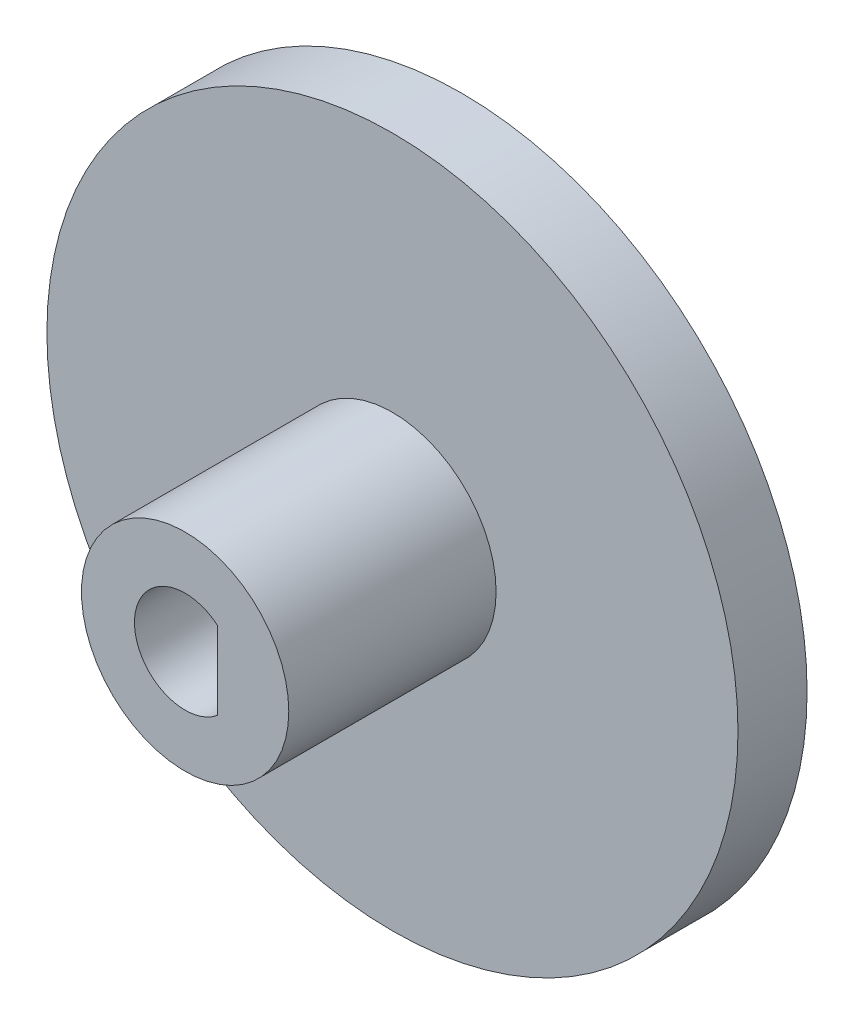
ISO-10303-21;
HEADER;
FILE_DESCRIPTION(('STEP AP214'),'2;1');
FILE_NAME('part.step','',(''),(''),'','','');
FILE_SCHEMA(('AUTOMOTIVE_DESIGN { 1 0 10303 214 1 1 1 1 }'));
ENDSEC;
DATA;
#1=APPLICATION_CONTEXT('core data for automotive mechanical design processes');
#2=APPLICATION_PROTOCOL_DEFINITION('international standard','automotive_design',2000,#1);
#3=PRODUCT_CONTEXT('',#1,'mechanical');
#4=PRODUCT('Part','Part','',(#3));
#5=PRODUCT_RELATED_PRODUCT_CATEGORY('part','',(#4));
#6=PRODUCT_DEFINITION_FORMATION('','',#4);
#7=PRODUCT_DEFINITION_CONTEXT('part definition',#1,'design');
#8=PRODUCT_DEFINITION('design','',#6,#7);
#9=PRODUCT_DEFINITION_SHAPE('','',#8);
#10=(LENGTH_UNIT() NAMED_UNIT(*) SI_UNIT(.MILLI.,.METRE.));
#11=(NAMED_UNIT(*) PLANE_ANGLE_UNIT() SI_UNIT($,.RADIAN.));
#12=(NAMED_UNIT(*) SI_UNIT($,.STERADIAN.) SOLID_ANGLE_UNIT());
#13=UNCERTAINTY_MEASURE_WITH_UNIT(LENGTH_MEASURE(1.E-05),#10,'distance_accuracy_value','');
#14=(GEOMETRIC_REPRESENTATION_CONTEXT(3) GLOBAL_UNCERTAINTY_ASSIGNED_CONTEXT((#13)) GLOBAL_UNIT_ASSIGNED_CONTEXT((#10,
#11,#12)) REPRESENTATION_CONTEXT('',''));
#15=CARTESIAN_POINT('',(0.,0.,0.));
#16=DIRECTION('',(0.,0.,1.));
#17=DIRECTION('',(1.,0.,0.));
#18=AXIS2_PLACEMENT_3D('',#15,#16,#17);
#19=CARTESIAN_POINT('',(0.,0.,9.));
#20=DIRECTION('',(0.,0.,1.));
#21=DIRECTION('',(1.,0.,0.));
#22=AXIS2_PLACEMENT_3D('',#19,#20,#21);
#23=PLANE('',#22);
#24=CARTESIAN_POINT('',(0.,0.,9.));
#25=DIRECTION('',(0.,0.,1.));
#26=DIRECTION('',(1.,0.,0.));
#27=AXIS2_PLACEMENT_3D('',#24,#25,#26);
#28=CIRCLE('',#27,4.5);
#29=CARTESIAN_POINT('',(4.5,0.,9.));
#30=VERTEX_POINT('',#29);
#31=EDGE_CURVE('E84',#30,#30,#28,.T.);
#32=ORIENTED_EDGE('',*,*,#31,.T.);
#33=EDGE_LOOP('',(#32));
#34=FACE_BOUND('',#33,.T.);
#35=DIRECTION('',(0.,-1.,0.));
#36=VECTOR('',#35,1.);
#37=CARTESIAN_POINT('',(1.4,0.,9.));
#38=LINE('',#37,#36);
#39=CARTESIAN_POINT('',(1.4,1.69705627484771,9.));
#40=VERTEX_POINT('',#39);
#41=CARTESIAN_POINT('',(1.4,-1.69705627484771,9.));
#42=VERTEX_POINT('',#41);
#43=EDGE_CURVE('E45',#40,#42,#38,.T.);
#44=ORIENTED_EDGE('',*,*,#43,.T.);
#45=CARTESIAN_POINT('',(0.,0.,9.));
#46=DIRECTION('',(0.,0.,1.));
#47=DIRECTION('',(1.,0.,0.));
#48=AXIS2_PLACEMENT_3D('',#45,#46,#47);
#49=CIRCLE('',#48,2.2);
#50=EDGE_CURVE('E11',#42,#40,#49,.F.);
#51=ORIENTED_EDGE('',*,*,#50,.T.);
#52=EDGE_LOOP('',(#44,#51));
#53=FACE_BOUND('',#52,.T.);
#54=ADVANCED_FACE('F37',(#34,#53),#23,.T.);
#55=CARTESIAN_POINT('',(0.,0.,9.));
#56=DIRECTION('',(0.,0.,-1.));
#57=DIRECTION('',(-1.,0.,0.));
#58=AXIS2_PLACEMENT_3D('',#55,#56,#57);
#59=CYLINDRICAL_SURFACE('',#58,4.5);
#60=ORIENTED_EDGE('',*,*,#31,.F.);
#61=EDGE_LOOP('',(#60));
#62=FACE_BOUND('',#61,.T.);
#63=CARTESIAN_POINT('',(0.,0.,0.));
#64=DIRECTION('',(0.,0.,1.));
#65=DIRECTION('',(1.,0.,0.));
#66=AXIS2_PLACEMENT_3D('',#63,#64,#65);
#67=CIRCLE('',#66,4.5);
#68=CARTESIAN_POINT('',(4.5,0.,0.));
#69=VERTEX_POINT('',#68);
#70=EDGE_CURVE('E81',#69,#69,#67,.T.);
#71=ORIENTED_EDGE('',*,*,#70,.T.);
#72=EDGE_LOOP('',(#71));
#73=FACE_BOUND('',#72,.T.);
#74=ADVANCED_FACE('F39',(#62,#73),#59,.T.);
#75=CARTESIAN_POINT('',(0.,0.,-3.));
#76=DIRECTION('',(0.,0.,1.));
#77=DIRECTION('',(1.,0.,0.));
#78=AXIS2_PLACEMENT_3D('',#75,#76,#77);
#79=CYLINDRICAL_SURFACE('',#78,15.);
#80=CARTESIAN_POINT('',(0.,0.,-3.));
#81=DIRECTION('',(0.,0.,1.));
#82=DIRECTION('',(1.,0.,0.));
#83=AXIS2_PLACEMENT_3D('',#80,#81,#82);
#84=CIRCLE('',#83,15.);
#85=CARTESIAN_POINT('',(15.,0.,-3.));
#86=VERTEX_POINT('',#85);
#87=EDGE_CURVE('E78',#86,#86,#84,.T.);
#88=ORIENTED_EDGE('',*,*,#87,.T.);
#89=EDGE_LOOP('',(#88));
#90=FACE_BOUND('',#89,.T.);
#91=CARTESIAN_POINT('',(0.,0.,0.));
#92=DIRECTION('',(0.,0.,1.));
#93=DIRECTION('',(1.,0.,0.));
#94=AXIS2_PLACEMENT_3D('',#91,#92,#93);
#95=CIRCLE('',#94,15.);
#96=CARTESIAN_POINT('',(15.,0.,0.));
#97=VERTEX_POINT('',#96);
#98=EDGE_CURVE('E66',#97,#97,#95,.T.);
#99=ORIENTED_EDGE('',*,*,#98,.F.);
#100=EDGE_LOOP('',(#99));
#101=FACE_BOUND('',#100,.T.);
#102=ADVANCED_FACE('F94',(#90,#101),#79,.T.);
#103=CARTESIAN_POINT('',(0.,0.,-3.));
#104=DIRECTION('',(0.,0.,1.));
#105=DIRECTION('',(1.,0.,0.));
#106=AXIS2_PLACEMENT_3D('',#103,#104,#105);
#107=PLANE('',#106);
#108=ORIENTED_EDGE('',*,*,#87,.F.);
#109=EDGE_LOOP('',(#108));
#110=FACE_BOUND('',#109,.T.);
#111=ADVANCED_FACE('F99',(#110),#107,.F.);
#112=CARTESIAN_POINT('',(0.,0.,0.));
#113=DIRECTION('',(0.,0.,1.));
#114=DIRECTION('',(1.,0.,0.));
#115=AXIS2_PLACEMENT_3D('',#112,#113,#114);
#116=PLANE('',#115);
#117=ORIENTED_EDGE('',*,*,#70,.F.);
#118=EDGE_LOOP('',(#117));
#119=FACE_BOUND('',#118,.T.);
#120=ORIENTED_EDGE('',*,*,#98,.T.);
#121=EDGE_LOOP('',(#120));
#122=FACE_BOUND('',#121,.T.);
#123=ADVANCED_FACE('F101',(#119,#122),#116,.T.);
#124=CARTESIAN_POINT('',(0.,0.,10.));
#125=DIRECTION('',(0.,0.,-1.));
#126=DIRECTION('',(-1.,0.,0.));
#127=AXIS2_PLACEMENT_3D('',#124,#125,#126);
#128=CYLINDRICAL_SURFACE('',#127,2.2);
#129=DIRECTION('',(0.,0.,-1.));
#130=VECTOR('',#129,1.);
#131=CARTESIAN_POINT('',(1.4,-1.69705627484771,10.));
#132=LINE('',#131,#130);
#133=CARTESIAN_POINT('',(1.4,-1.69705627484771,0.));
#134=VERTEX_POINT('',#133);
#135=EDGE_CURVE('E52',#42,#134,#132,.T.);
#136=ORIENTED_EDGE('',*,*,#135,.T.);
#137=CARTESIAN_POINT('',(0.,0.,0.));
#138=DIRECTION('',(0.,0.,1.));
#139=DIRECTION('',(1.,0.,0.));
#140=AXIS2_PLACEMENT_3D('',#137,#138,#139);
#141=CIRCLE('',#140,2.2);
#142=CARTESIAN_POINT('',(1.4,1.69705627484771,0.));
#143=VERTEX_POINT('',#142);
#144=EDGE_CURVE('E65',#143,#134,#141,.T.);
#145=ORIENTED_EDGE('',*,*,#144,.F.);
#146=DIRECTION('',(0.,0.,-1.));
#147=VECTOR('',#146,1.);
#148=CARTESIAN_POINT('',(1.4,1.69705627484771,10.));
#149=LINE('',#148,#147);
#150=EDGE_CURVE('E67',#40,#143,#149,.T.);
#151=ORIENTED_EDGE('',*,*,#150,.F.);
#152=ORIENTED_EDGE('',*,*,#50,.F.);
#153=EDGE_LOOP('',(#136,#145,#151,#152));
#154=FACE_BOUND('',#153,.T.);
#155=ADVANCED_FACE('F63',(#154),#128,.F.);
#156=CARTESIAN_POINT('',(1.4,1.69705627484771,10.));
#157=DIRECTION('',(-1.,0.,0.));
#158=DIRECTION('',(0.,0.,1.));
#159=AXIS2_PLACEMENT_3D('',#156,#157,#158);
#160=PLANE('',#159);
#161=ORIENTED_EDGE('',*,*,#150,.T.);
#162=DIRECTION('',(0.,1.,0.));
#163=VECTOR('',#162,1.);
#164=CARTESIAN_POINT('',(1.4,1.69705627484771,0.));
#165=LINE('',#164,#163);
#166=EDGE_CURVE('E70',#134,#143,#165,.T.);
#167=ORIENTED_EDGE('',*,*,#166,.F.);
#168=ORIENTED_EDGE('',*,*,#135,.F.);
#169=ORIENTED_EDGE('',*,*,#43,.F.);
#170=EDGE_LOOP('',(#161,#167,#168,#169));
#171=FACE_BOUND('',#170,.T.);
#172=ADVANCED_FACE('F71',(#171),#160,.T.);
#173=CARTESIAN_POINT('',(0.,0.,0.));
#174=DIRECTION('',(0.,0.,1.));
#175=DIRECTION('',(1.,0.,0.));
#176=AXIS2_PLACEMENT_3D('',#173,#174,#175);
#177=PLANE('',#176);
#178=ORIENTED_EDGE('',*,*,#144,.T.);
#179=ORIENTED_EDGE('',*,*,#166,.T.);
#180=EDGE_LOOP('',(#178,#179));
#181=FACE_BOUND('',#180,.T.);
#182=ADVANCED_FACE('F74',(#181),#177,.T.);
#183=CLOSED_SHELL('',(#54,#74,#102,#111,#123,#155,#172,#182));
#184=MANIFOLD_SOLID_BREP('B2',#183);
#185=ADVANCED_BREP_SHAPE_REPRESENTATION('',(#18,#184),#14);
#186=SHAPE_DEFINITION_REPRESENTATION(#9,#185);
ENDSEC;
END-ISO-10303-21;
